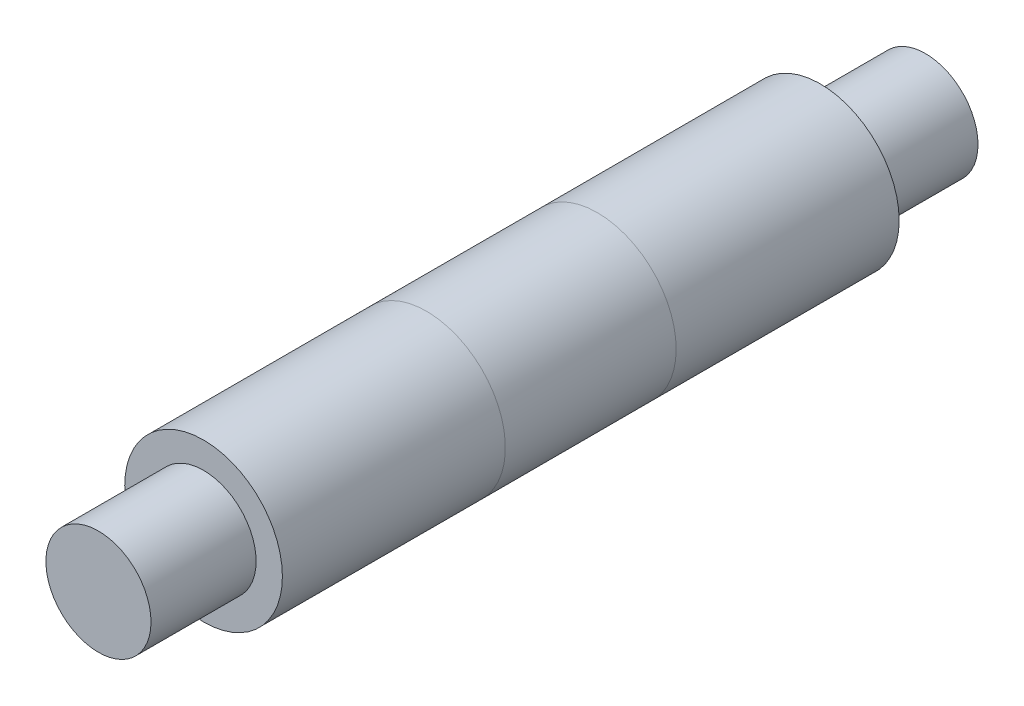
ISO-10303-21;
HEADER;
FILE_DESCRIPTION(('STEP AP214'),'2;1');
FILE_NAME('part.step','',(''),(''),'','','');
FILE_SCHEMA(('AUTOMOTIVE_DESIGN { 1 0 10303 214 1 1 1 1 }'));
ENDSEC;
DATA;
#1=APPLICATION_CONTEXT('core data for automotive mechanical design processes');
#2=APPLICATION_PROTOCOL_DEFINITION('international standard','automotive_design',2000,#1);
#3=PRODUCT_CONTEXT('',#1,'mechanical');
#4=PRODUCT('Part','Part','',(#3));
#5=PRODUCT_RELATED_PRODUCT_CATEGORY('part','',(#4));
#6=PRODUCT_DEFINITION_FORMATION('','',#4);
#7=PRODUCT_DEFINITION_CONTEXT('part definition',#1,'design');
#8=PRODUCT_DEFINITION('design','',#6,#7);
#9=PRODUCT_DEFINITION_SHAPE('','',#8);
#10=(LENGTH_UNIT() NAMED_UNIT(*) SI_UNIT(.MILLI.,.METRE.));
#11=(NAMED_UNIT(*) PLANE_ANGLE_UNIT() SI_UNIT($,.RADIAN.));
#12=(NAMED_UNIT(*) SI_UNIT($,.STERADIAN.) SOLID_ANGLE_UNIT());
#13=UNCERTAINTY_MEASURE_WITH_UNIT(LENGTH_MEASURE(1.E-05),#10,'distance_accuracy_value','');
#14=(GEOMETRIC_REPRESENTATION_CONTEXT(3) GLOBAL_UNCERTAINTY_ASSIGNED_CONTEXT((#13)) GLOBAL_UNIT_ASSIGNED_CONTEXT((#10,
#11,#12)) REPRESENTATION_CONTEXT('',''));
#15=CARTESIAN_POINT('',(0.,0.,0.));
#16=DIRECTION('',(0.,0.,1.));
#17=DIRECTION('',(1.,0.,0.));
#18=AXIS2_PLACEMENT_3D('',#15,#16,#17);
#19=CARTESIAN_POINT('',(0.,0.,74.5236));
#20=DIRECTION('',(0.,0.,-1.));
#21=DIRECTION('',(-1.,0.,0.));
#22=AXIS2_PLACEMENT_3D('',#19,#20,#21);
#23=CYLINDRICAL_SURFACE('',#22,19.05);
#24=CARTESIAN_POINT('',(0.,0.,74.5236));
#25=DIRECTION('',(0.,0.,1.));
#26=DIRECTION('',(1.,0.,0.));
#27=AXIS2_PLACEMENT_3D('',#24,#25,#26);
#28=CIRCLE('',#27,19.05);
#29=CARTESIAN_POINT('',(19.05,0.,74.5236));
#30=VERTEX_POINT('',#29);
#31=EDGE_CURVE('E56',#30,#30,#28,.T.);
#32=ORIENTED_EDGE('',*,*,#31,.F.);
#33=EDGE_LOOP('',(#32));
#34=FACE_BOUND('',#33,.T.);
#35=CARTESIAN_POINT('',(0.,0.,20.6375));
#36=DIRECTION('',(0.,0.,-1.));
#37=DIRECTION('',(-1.,0.,0.));
#38=AXIS2_PLACEMENT_3D('',#35,#36,#37);
#39=CIRCLE('',#38,19.05);
#40=CARTESIAN_POINT('',(-19.05,0.,20.6375));
#41=VERTEX_POINT('',#40);
#42=EDGE_CURVE('E10',#41,#41,#39,.T.);
#43=ORIENTED_EDGE('',*,*,#42,.F.);
#44=EDGE_LOOP('',(#43));
#45=FACE_BOUND('',#44,.T.);
#46=ADVANCED_FACE('F41',(#34,#45),#23,.T.);
#47=CARTESIAN_POINT('',(0.,0.,-74.5236));
#48=DIRECTION('',(0.,0.,1.));
#49=DIRECTION('',(1.,0.,0.));
#50=AXIS2_PLACEMENT_3D('',#47,#48,#49);
#51=CIRCLE('',#50,19.05);
#52=CARTESIAN_POINT('',(19.05,0.,-74.5236));
#53=VERTEX_POINT('',#52);
#54=EDGE_CURVE('E62',#53,#53,#51,.T.);
#55=ORIENTED_EDGE('',*,*,#54,.T.);
#56=EDGE_LOOP('',(#55));
#57=FACE_BOUND('',#56,.T.);
#58=CARTESIAN_POINT('',(0.,0.,-20.6375));
#59=DIRECTION('',(0.,0.,1.));
#60=DIRECTION('',(1.,0.,0.));
#61=AXIS2_PLACEMENT_3D('',#58,#59,#60);
#62=CIRCLE('',#61,19.05);
#63=CARTESIAN_POINT('',(19.05,0.,-20.6375));
#64=VERTEX_POINT('',#63);
#65=EDGE_CURVE('E49',#64,#64,#62,.T.);
#66=ORIENTED_EDGE('',*,*,#65,.F.);
#67=EDGE_LOOP('',(#66));
#68=FACE_BOUND('',#67,.T.);
#69=ADVANCED_FACE('F93',(#57,#68),#23,.T.);
#70=ORIENTED_EDGE('',*,*,#42,.T.);
#71=EDGE_LOOP('',(#70));
#72=FACE_BOUND('',#71,.T.);
#73=ORIENTED_EDGE('',*,*,#65,.T.);
#74=EDGE_LOOP('',(#73));
#75=FACE_BOUND('',#74,.T.);
#76=ADVANCED_FACE('F43',(#72,#75),#23,.T.);
#77=CARTESIAN_POINT('',(0.,0.,74.5236));
#78=DIRECTION('',(0.,0.,1.));
#79=DIRECTION('',(1.,0.,0.));
#80=AXIS2_PLACEMENT_3D('',#77,#78,#79);
#81=PLANE('',#80);
#82=CARTESIAN_POINT('',(0.,0.,74.5236));
#83=DIRECTION('',(0.,0.,1.));
#84=DIRECTION('',(1.,0.,0.));
#85=AXIS2_PLACEMENT_3D('',#82,#83,#84);
#86=CIRCLE('',#85,12.7);
#87=CARTESIAN_POINT('',(12.7,0.,74.5236));
#88=VERTEX_POINT('',#87);
#89=EDGE_CURVE('E68',#88,#88,#86,.T.);
#90=ORIENTED_EDGE('',*,*,#89,.F.);
#91=EDGE_LOOP('',(#90));
#92=FACE_BOUND('',#91,.T.);
#93=ORIENTED_EDGE('',*,*,#31,.T.);
#94=EDGE_LOOP('',(#93));
#95=FACE_BOUND('',#94,.T.);
#96=ADVANCED_FACE('F102',(#92,#95),#81,.T.);
#97=CARTESIAN_POINT('',(0.,0.,-74.5236));
#98=DIRECTION('',(0.,0.,1.));
#99=DIRECTION('',(1.,0.,0.));
#100=AXIS2_PLACEMENT_3D('',#97,#98,#99);
#101=PLANE('',#100);
#102=CARTESIAN_POINT('',(0.,0.,-74.5236));
#103=DIRECTION('',(0.,0.,1.));
#104=DIRECTION('',(1.,0.,0.));
#105=AXIS2_PLACEMENT_3D('',#102,#103,#104);
#106=CIRCLE('',#105,12.7);
#107=CARTESIAN_POINT('',(12.7,0.,-74.5236));
#108=VERTEX_POINT('',#107);
#109=EDGE_CURVE('E75',#108,#108,#106,.T.);
#110=ORIENTED_EDGE('',*,*,#109,.T.);
#111=EDGE_LOOP('',(#110));
#112=FACE_BOUND('',#111,.T.);
#113=ORIENTED_EDGE('',*,*,#54,.F.);
#114=EDGE_LOOP('',(#113));
#115=FACE_BOUND('',#114,.T.);
#116=ADVANCED_FACE('F106',(#112,#115),#101,.F.);
#117=CARTESIAN_POINT('',(0.,0.,99.9236));
#118=DIRECTION('',(0.,0.,-1.));
#119=DIRECTION('',(-1.,0.,0.));
#120=AXIS2_PLACEMENT_3D('',#117,#118,#119);
#121=CYLINDRICAL_SURFACE('',#120,12.7);
#122=CARTESIAN_POINT('',(0.,0.,99.9236));
#123=DIRECTION('',(0.,0.,1.));
#124=DIRECTION('',(1.,0.,0.));
#125=AXIS2_PLACEMENT_3D('',#122,#123,#124);
#126=CIRCLE('',#125,12.7);
#127=CARTESIAN_POINT('',(12.7,0.,99.9236));
#128=VERTEX_POINT('',#127);
#129=EDGE_CURVE('E66',#128,#128,#126,.T.);
#130=ORIENTED_EDGE('',*,*,#129,.F.);
#131=EDGE_LOOP('',(#130));
#132=FACE_BOUND('',#131,.T.);
#133=ORIENTED_EDGE('',*,*,#89,.T.);
#134=EDGE_LOOP('',(#133));
#135=FACE_BOUND('',#134,.T.);
#136=ADVANCED_FACE('F112',(#132,#135),#121,.T.);
#137=CARTESIAN_POINT('',(0.,0.,99.9236));
#138=DIRECTION('',(0.,0.,1.));
#139=DIRECTION('',(1.,0.,0.));
#140=AXIS2_PLACEMENT_3D('',#137,#138,#139);
#141=PLANE('',#140);
#142=ORIENTED_EDGE('',*,*,#129,.T.);
#143=EDGE_LOOP('',(#142));
#144=FACE_BOUND('',#143,.T.);
#145=ADVANCED_FACE('F90',(#144),#141,.T.);
#146=CARTESIAN_POINT('',(0.,0.,-99.9236));
#147=DIRECTION('',(0.,0.,1.));
#148=DIRECTION('',(1.,0.,0.));
#149=AXIS2_PLACEMENT_3D('',#146,#147,#148);
#150=CYLINDRICAL_SURFACE('',#149,12.7);
#151=CARTESIAN_POINT('',(0.,0.,-99.9236));
#152=DIRECTION('',(0.,0.,1.));
#153=DIRECTION('',(1.,0.,0.));
#154=AXIS2_PLACEMENT_3D('',#151,#152,#153);
#155=CIRCLE('',#154,12.7);
#156=CARTESIAN_POINT('',(12.7,0.,-99.9236));
#157=VERTEX_POINT('',#156);
#158=EDGE_CURVE('E71',#157,#157,#155,.T.);
#159=ORIENTED_EDGE('',*,*,#158,.T.);
#160=EDGE_LOOP('',(#159));
#161=FACE_BOUND('',#160,.T.);
#162=ORIENTED_EDGE('',*,*,#109,.F.);
#163=EDGE_LOOP('',(#162));
#164=FACE_BOUND('',#163,.T.);
#165=ADVANCED_FACE('F81',(#161,#164),#150,.T.);
#166=CARTESIAN_POINT('',(0.,0.,-99.9236));
#167=DIRECTION('',(0.,0.,-1.));
#168=DIRECTION('',(1.,0.,0.));
#169=AXIS2_PLACEMENT_3D('',#166,#167,#168);
#170=PLANE('',#169);
#171=ORIENTED_EDGE('',*,*,#158,.F.);
#172=EDGE_LOOP('',(#171));
#173=FACE_BOUND('',#172,.T.);
#174=ADVANCED_FACE('F84',(#173),#170,.T.);
#175=CLOSED_SHELL('',(#46,#69,#76,#96,#116,#136,#145,#165,#174));
#176=MANIFOLD_SOLID_BREP('B2',#175);
#177=ADVANCED_BREP_SHAPE_REPRESENTATION('',(#18,#176),#14);
#178=SHAPE_DEFINITION_REPRESENTATION(#9,#177);
ENDSEC;
END-ISO-10303-21;
